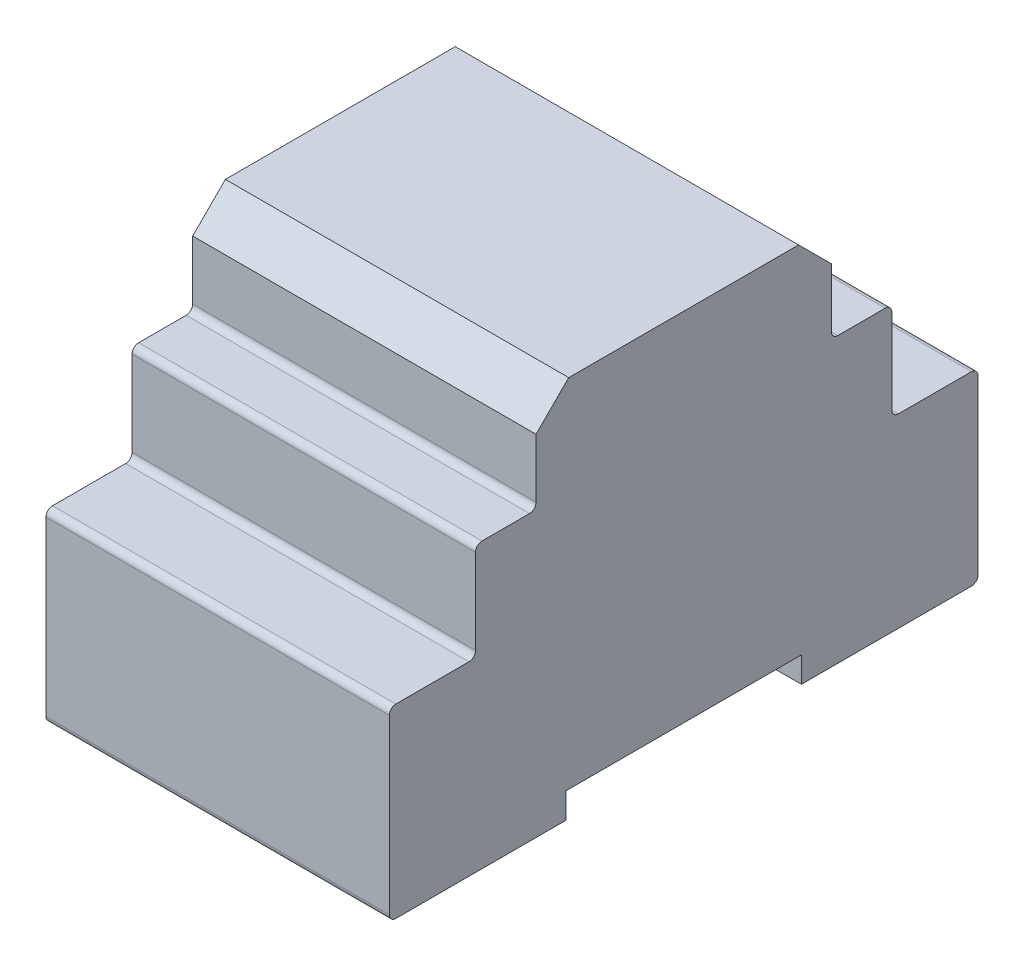
ISO-10303-21;
HEADER;
FILE_DESCRIPTION(('STEP AP214'),'2;1');
FILE_NAME('part.step','',(''),(''),'','','');
FILE_SCHEMA(('AUTOMOTIVE_DESIGN { 1 0 10303 214 1 1 1 1 }'));
ENDSEC;
DATA;
#1=APPLICATION_CONTEXT('core data for automotive mechanical design processes');
#2=APPLICATION_PROTOCOL_DEFINITION('international standard','automotive_design',2000,#1);
#3=PRODUCT_CONTEXT('',#1,'mechanical');
#4=PRODUCT('Part','Part','',(#3));
#5=PRODUCT_RELATED_PRODUCT_CATEGORY('part','',(#4));
#6=PRODUCT_DEFINITION_FORMATION('','',#4);
#7=PRODUCT_DEFINITION_CONTEXT('part definition',#1,'design');
#8=PRODUCT_DEFINITION('design','',#6,#7);
#9=PRODUCT_DEFINITION_SHAPE('','',#8);
#10=(LENGTH_UNIT() NAMED_UNIT(*) SI_UNIT(.MILLI.,.METRE.));
#11=(NAMED_UNIT(*) PLANE_ANGLE_UNIT() SI_UNIT($,.RADIAN.));
#12=(NAMED_UNIT(*) SI_UNIT($,.STERADIAN.) SOLID_ANGLE_UNIT());
#13=UNCERTAINTY_MEASURE_WITH_UNIT(LENGTH_MEASURE(1.E-05),#10,'distance_accuracy_value','');
#14=(GEOMETRIC_REPRESENTATION_CONTEXT(3) GLOBAL_UNCERTAINTY_ASSIGNED_CONTEXT((#13)) GLOBAL_UNIT_ASSIGNED_CONTEXT((#10,
#11,#12)) REPRESENTATION_CONTEXT('',''));
#15=CARTESIAN_POINT('',(0.,0.,0.));
#16=DIRECTION('',(0.,0.,1.));
#17=DIRECTION('',(1.,0.,0.));
#18=AXIS2_PLACEMENT_3D('',#15,#16,#17);
#19=CARTESIAN_POINT('',(0.,0.,0.));
#20=DIRECTION('',(0.,-1.,0.));
#21=DIRECTION('',(0.,0.,-1.));
#22=AXIS2_PLACEMENT_3D('',#19,#20,#21);
#23=PLANE('',#22);
#24=DIRECTION('',(0.,0.,1.));
#25=VECTOR('',#24,1.);
#26=CARTESIAN_POINT('',(0.,0.,0.));
#27=LINE('',#26,#25);
#28=CARTESIAN_POINT('',(0.,0.,-89.));
#29=VERTEX_POINT('',#28);
#30=CARTESIAN_POINT('',(0.,0.,-63.));
#31=VERTEX_POINT('',#30);
#32=EDGE_CURVE('E300',#29,#31,#27,.T.);
#33=ORIENTED_EDGE('',*,*,#32,.F.);
#34=DIRECTION('',(-1.,0.,0.));
#35=VECTOR('',#34,1.);
#36=CARTESIAN_POINT('',(52.5,0.,-89.));
#37=LINE('',#36,#35);
#38=CARTESIAN_POINT('',(52.5,0.,-89.));
#39=VERTEX_POINT('',#38);
#40=EDGE_CURVE('E351',#29,#39,#37,.F.);
#41=ORIENTED_EDGE('',*,*,#40,.T.);
#42=DIRECTION('',(0.,0.,-1.));
#43=VECTOR('',#42,1.);
#44=CARTESIAN_POINT('',(52.5,0.,0.));
#45=LINE('',#44,#43);
#46=CARTESIAN_POINT('',(52.5,0.,-63.));
#47=VERTEX_POINT('',#46);
#48=EDGE_CURVE('E302',#47,#39,#45,.T.);
#49=ORIENTED_EDGE('',*,*,#48,.F.);
#50=DIRECTION('',(1.,0.,0.));
#51=VECTOR('',#50,1.);
#52=CARTESIAN_POINT('',(52.5,0.,-63.));
#53=LINE('',#52,#51);
#54=EDGE_CURVE('E236',#31,#47,#53,.T.);
#55=ORIENTED_EDGE('',*,*,#54,.F.);
#56=EDGE_LOOP('',(#33,#41,#49,#55));
#57=FACE_BOUND('',#56,.T.);
#58=ADVANCED_FACE('F33',(#57),#23,.T.);
#59=CARTESIAN_POINT('',(0.,58.4,-90.));
#60=DIRECTION('',(0.,0.,1.));
#61=DIRECTION('',(1.,0.,0.));
#62=AXIS2_PLACEMENT_3D('',#59,#60,#61);
#63=PLANE('',#62);
#64=DIRECTION('',(0.,-1.,0.));
#65=VECTOR('',#64,1.);
#66=CARTESIAN_POINT('',(52.5,58.4,-90.));
#67=LINE('',#66,#65);
#68=CARTESIAN_POINT('',(52.5,27.4,-90.));
#69=VERTEX_POINT('',#68);
#70=CARTESIAN_POINT('',(52.5,1.,-90.));
#71=VERTEX_POINT('',#70);
#72=EDGE_CURVE('E306',#69,#71,#67,.T.);
#73=ORIENTED_EDGE('',*,*,#72,.T.);
#74=DIRECTION('',(-1.,0.,0.));
#75=VECTOR('',#74,1.);
#76=CARTESIAN_POINT('',(0.,1.,-90.));
#77=LINE('',#76,#75);
#78=CARTESIAN_POINT('',(0.,1.,-90.));
#79=VERTEX_POINT('',#78);
#80=EDGE_CURVE('E336',#71,#79,#77,.T.);
#81=ORIENTED_EDGE('',*,*,#80,.T.);
#82=DIRECTION('',(0.,-1.,0.));
#83=VECTOR('',#82,1.);
#84=CARTESIAN_POINT('',(0.,58.4,-90.));
#85=LINE('',#84,#83);
#86=CARTESIAN_POINT('',(0.,27.4,-90.));
#87=VERTEX_POINT('',#86);
#88=EDGE_CURVE('E299',#87,#79,#85,.T.);
#89=ORIENTED_EDGE('',*,*,#88,.F.);
#90=DIRECTION('',(-1.,0.,0.));
#91=VECTOR('',#90,1.);
#92=CARTESIAN_POINT('',(52.5,27.4,-90.));
#93=LINE('',#92,#91);
#94=EDGE_CURVE('E334',#87,#69,#93,.F.);
#95=ORIENTED_EDGE('',*,*,#94,.T.);
#96=EDGE_LOOP('',(#73,#81,#89,#95));
#97=FACE_BOUND('',#96,.T.);
#98=ADVANCED_FACE('F458',(#97),#63,.F.);
#99=CARTESIAN_POINT('',(0.,58.4,0.));
#100=DIRECTION('',(1.,0.,0.));
#101=DIRECTION('',(0.,0.,-1.));
#102=AXIS2_PLACEMENT_3D('',#99,#100,#101);
#103=PLANE('',#102);
#104=ORIENTED_EDGE('',*,*,#88,.T.);
#105=CARTESIAN_POINT('',(0.,1.,-89.));
#106=DIRECTION('',(1.,0.,0.));
#107=DIRECTION('',(0.,0.,-1.));
#108=AXIS2_PLACEMENT_3D('',#105,#106,#107);
#109=CIRCLE('',#108,1.);
#110=EDGE_CURVE('E349',#79,#29,#109,.F.);
#111=ORIENTED_EDGE('',*,*,#110,.T.);
#112=ORIENTED_EDGE('',*,*,#32,.T.);
#113=DIRECTION('',(0.,-1.,0.));
#114=VECTOR('',#113,1.);
#115=CARTESIAN_POINT('',(0.,3.9,-63.));
#116=LINE('',#115,#114);
#117=CARTESIAN_POINT('',(0.,3.9,-63.));
#118=VERTEX_POINT('',#117);
#119=EDGE_CURVE('E242',#118,#31,#116,.T.);
#120=ORIENTED_EDGE('',*,*,#119,.F.);
#121=DIRECTION('',(0.,0.,-1.));
#122=VECTOR('',#121,1.);
#123=CARTESIAN_POINT('',(0.,3.9,-63.));
#124=LINE('',#123,#122);
#125=CARTESIAN_POINT('',(0.,3.9,-27.));
#126=VERTEX_POINT('',#125);
#127=EDGE_CURVE('E227',#126,#118,#124,.T.);
#128=ORIENTED_EDGE('',*,*,#127,.F.);
#129=DIRECTION('',(0.,-1.,0.));
#130=VECTOR('',#129,1.);
#131=CARTESIAN_POINT('',(0.,3.9,-27.));
#132=LINE('',#131,#130);
#133=CARTESIAN_POINT('',(0.,0.,-27.));
#134=VERTEX_POINT('',#133);
#135=EDGE_CURVE('E224',#126,#134,#132,.T.);
#136=ORIENTED_EDGE('',*,*,#135,.T.);
#137=CARTESIAN_POINT('',(0.,0.,-1.));
#138=VERTEX_POINT('',#137);
#139=EDGE_CURVE('E291',#134,#138,#27,.T.);
#140=ORIENTED_EDGE('',*,*,#139,.T.);
#141=CARTESIAN_POINT('',(0.,1.,-1.));
#142=DIRECTION('',(1.,0.,0.));
#143=DIRECTION('',(0.,0.,-1.));
#144=AXIS2_PLACEMENT_3D('',#141,#142,#143);
#145=CIRCLE('',#144,1.);
#146=CARTESIAN_POINT('',(0.,1.,0.));
#147=VERTEX_POINT('',#146);
#148=EDGE_CURVE('E347',#138,#147,#145,.F.);
#149=ORIENTED_EDGE('',*,*,#148,.T.);
#150=DIRECTION('',(0.,-1.,0.));
#151=VECTOR('',#150,1.);
#152=CARTESIAN_POINT('',(0.,58.4,0.));
#153=LINE('',#152,#151);
#154=CARTESIAN_POINT('',(0.,27.4,0.));
#155=VERTEX_POINT('',#154);
#156=EDGE_CURVE('E311',#155,#147,#153,.T.);
#157=ORIENTED_EDGE('',*,*,#156,.F.);
#158=CARTESIAN_POINT('',(0.,27.4,-1.));
#159=DIRECTION('',(1.,0.,0.));
#160=DIRECTION('',(0.,0.,-1.));
#161=AXIS2_PLACEMENT_3D('',#158,#159,#160);
#162=CIRCLE('',#161,1.);
#163=CARTESIAN_POINT('',(0.,28.4,-1.));
#164=VERTEX_POINT('',#163);
#165=EDGE_CURVE('E345',#155,#164,#162,.F.);
#166=ORIENTED_EDGE('',*,*,#165,.T.);
#167=DIRECTION('',(0.,0.,1.));
#168=VECTOR('',#167,1.);
#169=CARTESIAN_POINT('',(0.,28.4,0.));
#170=LINE('',#169,#168);
#171=CARTESIAN_POINT('',(0.,28.4,-12.17));
#172=VERTEX_POINT('',#171);
#173=EDGE_CURVE('E247',#172,#164,#170,.T.);
#174=ORIENTED_EDGE('',*,*,#173,.F.);
#175=CARTESIAN_POINT('',(0.,29.4,-12.17));
#176=DIRECTION('',(1.,0.,0.));
#177=DIRECTION('',(0.,0.,-1.));
#178=AXIS2_PLACEMENT_3D('',#175,#176,#177);
#179=CIRCLE('',#178,1.);
#180=CARTESIAN_POINT('',(0.,29.4,-13.17));
#181=VERTEX_POINT('',#180);
#182=EDGE_CURVE('E406',#172,#181,#179,.T.);
#183=ORIENTED_EDGE('',*,*,#182,.T.);
#184=DIRECTION('',(0.,1.,0.));
#185=VECTOR('',#184,1.);
#186=CARTESIAN_POINT('',(0.,28.4,-13.17));
#187=LINE('',#186,#185);
#188=CARTESIAN_POINT('',(0.,42.4,-13.17));
#189=VERTEX_POINT('',#188);
#190=EDGE_CURVE('E255',#181,#189,#187,.T.);
#191=ORIENTED_EDGE('',*,*,#190,.T.);
#192=CARTESIAN_POINT('',(0.,42.4,-14.17));
#193=DIRECTION('',(1.,0.,0.));
#194=DIRECTION('',(0.,0.,-1.));
#195=AXIS2_PLACEMENT_3D('',#192,#193,#194);
#196=CIRCLE('',#195,1.);
#197=CARTESIAN_POINT('',(0.,43.4,-14.17));
#198=VERTEX_POINT('',#197);
#199=EDGE_CURVE('E343',#189,#198,#196,.F.);
#200=ORIENTED_EDGE('',*,*,#199,.T.);
#201=DIRECTION('',(0.,0.,1.));
#202=VECTOR('',#201,1.);
#203=CARTESIAN_POINT('',(0.,43.4,0.));
#204=LINE('',#203,#202);
#205=CARTESIAN_POINT('',(0.,43.4,-21.425));
#206=VERTEX_POINT('',#205);
#207=EDGE_CURVE('E270',#206,#198,#204,.T.);
#208=ORIENTED_EDGE('',*,*,#207,.F.);
#209=CARTESIAN_POINT('',(0.,44.4,-21.425));
#210=DIRECTION('',(1.,0.,0.));
#211=DIRECTION('',(0.,0.,-1.));
#212=AXIS2_PLACEMENT_3D('',#209,#210,#211);
#213=CIRCLE('',#212,1.);
#214=CARTESIAN_POINT('',(0.,44.4,-22.425));
#215=VERTEX_POINT('',#214);
#216=EDGE_CURVE('E410',#206,#215,#213,.T.);
#217=ORIENTED_EDGE('',*,*,#216,.T.);
#218=DIRECTION('',(0.,1.,0.));
#219=VECTOR('',#218,1.);
#220=CARTESIAN_POINT('',(0.,43.4,-22.425));
#221=LINE('',#220,#219);
#222=CARTESIAN_POINT('',(0.,53.4,-22.425));
#223=VERTEX_POINT('',#222);
#224=EDGE_CURVE('E279',#215,#223,#221,.T.);
#225=ORIENTED_EDGE('',*,*,#224,.T.);
#226=DIRECTION('',(0.,-0.707106781186546,0.707106781186549));
#227=VECTOR('',#226,1.);
#228=CARTESIAN_POINT('',(0.,53.4,-22.425));
#229=LINE('',#228,#227);
#230=CARTESIAN_POINT('',(0.,58.4,-27.425));
#231=VERTEX_POINT('',#230);
#232=EDGE_CURVE('E326',#223,#231,#229,.F.);
#233=ORIENTED_EDGE('',*,*,#232,.T.);
#234=DIRECTION('',(0.,0.,1.));
#235=VECTOR('',#234,1.);
#236=CARTESIAN_POINT('',(0.,58.4,0.));
#237=LINE('',#236,#235);
#238=CARTESIAN_POINT('',(0.,58.4,-62.575));
#239=VERTEX_POINT('',#238);
#240=EDGE_CURVE('E293',#239,#231,#237,.T.);
#241=ORIENTED_EDGE('',*,*,#240,.F.);
#242=DIRECTION('',(0.,0.707106781186546,0.707106781186549));
#243=VECTOR('',#242,1.);
#244=CARTESIAN_POINT('',(0.,53.4,-67.575));
#245=LINE('',#244,#243);
#246=CARTESIAN_POINT('',(0.,53.4,-67.575));
#247=VERTEX_POINT('',#246);
#248=EDGE_CURVE('E328',#239,#247,#245,.F.);
#249=ORIENTED_EDGE('',*,*,#248,.T.);
#250=DIRECTION('',(0.,1.,0.));
#251=VECTOR('',#250,1.);
#252=CARTESIAN_POINT('',(0.,43.4,-67.575));
#253=LINE('',#252,#251);
#254=CARTESIAN_POINT('',(0.,44.4,-67.575));
#255=VERTEX_POINT('',#254);
#256=EDGE_CURVE('E288',#255,#247,#253,.T.);
#257=ORIENTED_EDGE('',*,*,#256,.F.);
#258=CARTESIAN_POINT('',(0.,44.4,-68.575));
#259=DIRECTION('',(1.,0.,0.));
#260=DIRECTION('',(0.,0.,-1.));
#261=AXIS2_PLACEMENT_3D('',#258,#259,#260);
#262=CIRCLE('',#261,1.);
#263=CARTESIAN_POINT('',(0.,43.4,-68.575));
#264=VERTEX_POINT('',#263);
#265=EDGE_CURVE('E11',#255,#264,#262,.T.);
#266=ORIENTED_EDGE('',*,*,#265,.T.);
#267=DIRECTION('',(0.,0.,1.));
#268=VECTOR('',#267,1.);
#269=CARTESIAN_POINT('',(0.,43.4,-90.));
#270=LINE('',#269,#268);
#271=CARTESIAN_POINT('',(0.,43.4,-75.82));
#272=VERTEX_POINT('',#271);
#273=EDGE_CURVE('E281',#272,#264,#270,.T.);
#274=ORIENTED_EDGE('',*,*,#273,.F.);
#275=CARTESIAN_POINT('',(0.,42.4,-75.82));
#276=DIRECTION('',(1.,0.,0.));
#277=DIRECTION('',(0.,0.,-1.));
#278=AXIS2_PLACEMENT_3D('',#275,#276,#277);
#279=CIRCLE('',#278,1.);
#280=CARTESIAN_POINT('',(0.,42.4,-76.82));
#281=VERTEX_POINT('',#280);
#282=EDGE_CURVE('E339',#272,#281,#279,.F.);
#283=ORIENTED_EDGE('',*,*,#282,.T.);
#284=DIRECTION('',(0.,1.,0.));
#285=VECTOR('',#284,1.);
#286=CARTESIAN_POINT('',(0.,28.4,-76.82));
#287=LINE('',#286,#285);
#288=CARTESIAN_POINT('',(0.,29.4,-76.82));
#289=VERTEX_POINT('',#288);
#290=EDGE_CURVE('E266',#289,#281,#287,.T.);
#291=ORIENTED_EDGE('',*,*,#290,.F.);
#292=CARTESIAN_POINT('',(0.,29.4,-77.82));
#293=DIRECTION('',(1.,0.,0.));
#294=DIRECTION('',(0.,0.,-1.));
#295=AXIS2_PLACEMENT_3D('',#292,#293,#294);
#296=CIRCLE('',#295,1.);
#297=CARTESIAN_POINT('',(0.,28.4,-77.82));
#298=VERTEX_POINT('',#297);
#299=EDGE_CURVE('E416',#289,#298,#296,.T.);
#300=ORIENTED_EDGE('',*,*,#299,.T.);
#301=DIRECTION('',(0.,0.,1.));
#302=VECTOR('',#301,1.);
#303=CARTESIAN_POINT('',(0.,28.4,-90.));
#304=LINE('',#303,#302);
#305=CARTESIAN_POINT('',(0.,28.4,-89.));
#306=VERTEX_POINT('',#305);
#307=EDGE_CURVE('E258',#306,#298,#304,.T.);
#308=ORIENTED_EDGE('',*,*,#307,.F.);
#309=CARTESIAN_POINT('',(0.,27.4,-89.));
#310=DIRECTION('',(1.,0.,0.));
#311=DIRECTION('',(0.,0.,-1.));
#312=AXIS2_PLACEMENT_3D('',#309,#310,#311);
#313=CIRCLE('',#312,1.);
#314=EDGE_CURVE('E341',#306,#87,#313,.F.);
#315=ORIENTED_EDGE('',*,*,#314,.T.);
#316=EDGE_LOOP('',(#104,#111,#112,#120,#128,#136,#140,#149,#157,#166,#174,#183,#191,#200,#208,
#217,#225,#233,#241,#249,#257,#266,#274,#283,#291,#300,#308,#315));
#317=FACE_BOUND('',#316,.T.);
#318=ADVANCED_FACE('F430',(#317),#103,.F.);
#319=CARTESIAN_POINT('',(0.,58.4,0.));
#320=DIRECTION('',(0.,0.,-1.));
#321=DIRECTION('',(-1.,0.,0.));
#322=AXIS2_PLACEMENT_3D('',#319,#320,#321);
#323=PLANE('',#322);
#324=ORIENTED_EDGE('',*,*,#156,.T.);
#325=DIRECTION('',(1.,0.,0.));
#326=VECTOR('',#325,1.);
#327=CARTESIAN_POINT('',(52.5,1.,0.));
#328=LINE('',#327,#326);
#329=CARTESIAN_POINT('',(52.5,1.,0.));
#330=VERTEX_POINT('',#329);
#331=EDGE_CURVE('E366',#147,#330,#328,.T.);
#332=ORIENTED_EDGE('',*,*,#331,.T.);
#333=DIRECTION('',(0.,-1.,0.));
#334=VECTOR('',#333,1.);
#335=CARTESIAN_POINT('',(52.5,58.4,0.));
#336=LINE('',#335,#334);
#337=CARTESIAN_POINT('',(52.5,27.4,0.));
#338=VERTEX_POINT('',#337);
#339=EDGE_CURVE('E309',#338,#330,#336,.T.);
#340=ORIENTED_EDGE('',*,*,#339,.F.);
#341=DIRECTION('',(1.,0.,0.));
#342=VECTOR('',#341,1.);
#343=CARTESIAN_POINT('',(0.,27.4,0.));
#344=LINE('',#343,#342);
#345=EDGE_CURVE('E364',#338,#155,#344,.F.);
#346=ORIENTED_EDGE('',*,*,#345,.T.);
#347=EDGE_LOOP('',(#324,#332,#340,#346));
#348=FACE_BOUND('',#347,.T.);
#349=ADVANCED_FACE('F487',(#348),#323,.F.);
#350=CARTESIAN_POINT('',(52.5,58.4,0.));
#351=DIRECTION('',(-1.,0.,0.));
#352=DIRECTION('',(0.,0.,1.));
#353=AXIS2_PLACEMENT_3D('',#350,#351,#352);
#354=PLANE('',#353);
#355=ORIENTED_EDGE('',*,*,#48,.T.);
#356=CARTESIAN_POINT('',(52.5,1.,-89.));
#357=DIRECTION('',(-1.,0.,0.));
#358=DIRECTION('',(0.,0.,1.));
#359=AXIS2_PLACEMENT_3D('',#356,#357,#358);
#360=CIRCLE('',#359,1.);
#361=EDGE_CURVE('E362',#39,#71,#360,.F.);
#362=ORIENTED_EDGE('',*,*,#361,.T.);
#363=ORIENTED_EDGE('',*,*,#72,.F.);
#364=CARTESIAN_POINT('',(52.5,27.4,-89.));
#365=DIRECTION('',(-1.,0.,0.));
#366=DIRECTION('',(0.,0.,1.));
#367=AXIS2_PLACEMENT_3D('',#364,#365,#366);
#368=CIRCLE('',#367,1.);
#369=CARTESIAN_POINT('',(52.5,28.4,-89.));
#370=VERTEX_POINT('',#369);
#371=EDGE_CURVE('E355',#69,#370,#368,.F.);
#372=ORIENTED_EDGE('',*,*,#371,.T.);
#373=DIRECTION('',(0.,0.,-1.));
#374=VECTOR('',#373,1.);
#375=CARTESIAN_POINT('',(52.5,28.4,-90.));
#376=LINE('',#375,#374);
#377=CARTESIAN_POINT('',(52.5,28.4,-77.82));
#378=VERTEX_POINT('',#377);
#379=EDGE_CURVE('E263',#378,#370,#376,.T.);
#380=ORIENTED_EDGE('',*,*,#379,.F.);
#381=CARTESIAN_POINT('',(52.5,29.4,-77.82));
#382=DIRECTION('',(-1.,0.,0.));
#383=DIRECTION('',(0.,0.,1.));
#384=AXIS2_PLACEMENT_3D('',#381,#382,#383);
#385=CIRCLE('',#384,1.);
#386=CARTESIAN_POINT('',(52.5,29.4,-76.82));
#387=VERTEX_POINT('',#386);
#388=EDGE_CURVE('E414',#378,#387,#385,.T.);
#389=ORIENTED_EDGE('',*,*,#388,.T.);
#390=DIRECTION('',(0.,1.,0.));
#391=VECTOR('',#390,1.);
#392=CARTESIAN_POINT('',(52.5,28.4,-76.82));
#393=LINE('',#392,#391);
#394=CARTESIAN_POINT('',(52.5,42.4,-76.82));
#395=VERTEX_POINT('',#394);
#396=EDGE_CURVE('E267',#387,#395,#393,.T.);
#397=ORIENTED_EDGE('',*,*,#396,.T.);
#398=CARTESIAN_POINT('',(52.5,42.4,-75.82));
#399=DIRECTION('',(-1.,0.,0.));
#400=DIRECTION('',(0.,0.,1.));
#401=AXIS2_PLACEMENT_3D('',#398,#399,#400);
#402=CIRCLE('',#401,1.);
#403=CARTESIAN_POINT('',(52.5,43.4,-75.82));
#404=VERTEX_POINT('',#403);
#405=EDGE_CURVE('E353',#395,#404,#402,.F.);
#406=ORIENTED_EDGE('',*,*,#405,.T.);
#407=DIRECTION('',(0.,0.,-1.));
#408=VECTOR('',#407,1.);
#409=CARTESIAN_POINT('',(52.5,43.4,-90.));
#410=LINE('',#409,#408);
#411=CARTESIAN_POINT('',(52.5,43.4,-68.575));
#412=VERTEX_POINT('',#411);
#413=EDGE_CURVE('E285',#412,#404,#410,.T.);
#414=ORIENTED_EDGE('',*,*,#413,.F.);
#415=CARTESIAN_POINT('',(52.5,44.4,-68.575));
#416=DIRECTION('',(-1.,0.,0.));
#417=DIRECTION('',(0.,0.,1.));
#418=AXIS2_PLACEMENT_3D('',#415,#416,#417);
#419=CIRCLE('',#418,1.);
#420=CARTESIAN_POINT('',(52.5,44.4,-67.575));
#421=VERTEX_POINT('',#420);
#422=EDGE_CURVE('E41',#412,#421,#419,.T.);
#423=ORIENTED_EDGE('',*,*,#422,.T.);
#424=DIRECTION('',(0.,1.,0.));
#425=VECTOR('',#424,1.);
#426=CARTESIAN_POINT('',(52.5,43.4,-67.575));
#427=LINE('',#426,#425);
#428=CARTESIAN_POINT('',(52.5,53.4,-67.575));
#429=VERTEX_POINT('',#428);
#430=EDGE_CURVE('E289',#421,#429,#427,.T.);
#431=ORIENTED_EDGE('',*,*,#430,.T.);
#432=DIRECTION('',(0.,-0.707106781186546,-0.707106781186549));
#433=VECTOR('',#432,1.);
#434=CARTESIAN_POINT('',(52.5,53.4,-67.575));
#435=LINE('',#434,#433);
#436=CARTESIAN_POINT('',(52.5,58.4,-62.575));
#437=VERTEX_POINT('',#436);
#438=EDGE_CURVE('E320',#429,#437,#435,.F.);
#439=ORIENTED_EDGE('',*,*,#438,.T.);
#440=DIRECTION('',(0.,0.,-1.));
#441=VECTOR('',#440,1.);
#442=CARTESIAN_POINT('',(52.5,58.4,0.));
#443=LINE('',#442,#441);
#444=CARTESIAN_POINT('',(52.5,58.4,-27.425));
#445=VERTEX_POINT('',#444);
#446=EDGE_CURVE('E296',#445,#437,#443,.T.);
#447=ORIENTED_EDGE('',*,*,#446,.F.);
#448=DIRECTION('',(0.,0.707106781186546,-0.707106781186549));
#449=VECTOR('',#448,1.);
#450=CARTESIAN_POINT('',(52.5,53.4,-22.425));
#451=LINE('',#450,#449);
#452=CARTESIAN_POINT('',(52.5,53.4,-22.425));
#453=VERTEX_POINT('',#452);
#454=EDGE_CURVE('E317',#445,#453,#451,.F.);
#455=ORIENTED_EDGE('',*,*,#454,.T.);
#456=DIRECTION('',(0.,1.,0.));
#457=VECTOR('',#456,1.);
#458=CARTESIAN_POINT('',(52.5,43.4,-22.425));
#459=LINE('',#458,#457);
#460=CARTESIAN_POINT('',(52.5,44.4,-22.425));
#461=VERTEX_POINT('',#460);
#462=EDGE_CURVE('E278',#461,#453,#459,.T.);
#463=ORIENTED_EDGE('',*,*,#462,.F.);
#464=CARTESIAN_POINT('',(52.5,44.4,-21.425));
#465=DIRECTION('',(-1.,0.,0.));
#466=DIRECTION('',(0.,0.,1.));
#467=AXIS2_PLACEMENT_3D('',#464,#465,#466);
#468=CIRCLE('',#467,1.);
#469=CARTESIAN_POINT('',(52.5,43.4,-21.425));
#470=VERTEX_POINT('',#469);
#471=EDGE_CURVE('E412',#461,#470,#468,.T.);
#472=ORIENTED_EDGE('',*,*,#471,.T.);
#473=DIRECTION('',(0.,0.,-1.));
#474=VECTOR('',#473,1.);
#475=CARTESIAN_POINT('',(52.5,43.4,0.));
#476=LINE('',#475,#474);
#477=CARTESIAN_POINT('',(52.5,43.4,-14.17));
#478=VERTEX_POINT('',#477);
#479=EDGE_CURVE('E275',#478,#470,#476,.T.);
#480=ORIENTED_EDGE('',*,*,#479,.F.);
#481=CARTESIAN_POINT('',(52.5,42.4,-14.17));
#482=DIRECTION('',(-1.,0.,0.));
#483=DIRECTION('',(0.,0.,1.));
#484=AXIS2_PLACEMENT_3D('',#481,#482,#483);
#485=CIRCLE('',#484,1.);
#486=CARTESIAN_POINT('',(52.5,42.4,-13.17));
#487=VERTEX_POINT('',#486);
#488=EDGE_CURVE('E357',#478,#487,#485,.F.);
#489=ORIENTED_EDGE('',*,*,#488,.T.);
#490=DIRECTION('',(0.,1.,0.));
#491=VECTOR('',#490,1.);
#492=CARTESIAN_POINT('',(52.5,28.4,-13.17));
#493=LINE('',#492,#491);
#494=CARTESIAN_POINT('',(52.5,29.4,-13.17));
#495=VERTEX_POINT('',#494);
#496=EDGE_CURVE('E254',#495,#487,#493,.T.);
#497=ORIENTED_EDGE('',*,*,#496,.F.);
#498=CARTESIAN_POINT('',(52.5,29.4,-12.17));
#499=DIRECTION('',(-1.,0.,0.));
#500=DIRECTION('',(0.,0.,1.));
#501=AXIS2_PLACEMENT_3D('',#498,#499,#500);
#502=CIRCLE('',#501,1.);
#503=CARTESIAN_POINT('',(52.5,28.4,-12.17));
#504=VERTEX_POINT('',#503);
#505=EDGE_CURVE('E408',#495,#504,#502,.T.);
#506=ORIENTED_EDGE('',*,*,#505,.T.);
#507=DIRECTION('',(0.,0.,-1.));
#508=VECTOR('',#507,1.);
#509=CARTESIAN_POINT('',(52.5,28.4,0.));
#510=LINE('',#509,#508);
#511=CARTESIAN_POINT('',(52.5,28.4,-1.));
#512=VERTEX_POINT('',#511);
#513=EDGE_CURVE('E250',#512,#504,#510,.T.);
#514=ORIENTED_EDGE('',*,*,#513,.F.);
#515=CARTESIAN_POINT('',(52.5,27.4,-1.));
#516=DIRECTION('',(-1.,0.,0.));
#517=DIRECTION('',(0.,0.,1.));
#518=AXIS2_PLACEMENT_3D('',#515,#516,#517);
#519=CIRCLE('',#518,1.);
#520=EDGE_CURVE('E359',#512,#338,#519,.F.);
#521=ORIENTED_EDGE('',*,*,#520,.T.);
#522=ORIENTED_EDGE('',*,*,#339,.T.);
#523=CARTESIAN_POINT('',(52.5,1.,-1.));
#524=DIRECTION('',(-1.,0.,0.));
#525=DIRECTION('',(0.,0.,1.));
#526=AXIS2_PLACEMENT_3D('',#523,#524,#525);
#527=CIRCLE('',#526,1.);
#528=CARTESIAN_POINT('',(52.5,0.,-1.));
#529=VERTEX_POINT('',#528);
#530=EDGE_CURVE('E48',#330,#529,#527,.F.);
#531=ORIENTED_EDGE('',*,*,#530,.T.);
#532=CARTESIAN_POINT('',(52.5,0.,-27.));
#533=VERTEX_POINT('',#532);
#534=EDGE_CURVE('E240',#529,#533,#45,.T.);
#535=ORIENTED_EDGE('',*,*,#534,.T.);
#536=DIRECTION('',(0.,-1.,0.));
#537=VECTOR('',#536,1.);
#538=CARTESIAN_POINT('',(52.5,3.9,-27.));
#539=LINE('',#538,#537);
#540=CARTESIAN_POINT('',(52.5,3.9,-27.));
#541=VERTEX_POINT('',#540);
#542=EDGE_CURVE('E221',#541,#533,#539,.T.);
#543=ORIENTED_EDGE('',*,*,#542,.F.);
#544=DIRECTION('',(0.,0.,1.));
#545=VECTOR('',#544,1.);
#546=CARTESIAN_POINT('',(52.5,3.9,-63.));
#547=LINE('',#546,#545);
#548=CARTESIAN_POINT('',(52.5,3.9,-63.));
#549=VERTEX_POINT('',#548);
#550=EDGE_CURVE('E228',#549,#541,#547,.T.);
#551=ORIENTED_EDGE('',*,*,#550,.F.);
#552=DIRECTION('',(0.,-1.,0.));
#553=VECTOR('',#552,1.);
#554=CARTESIAN_POINT('',(52.5,3.9,-63.));
#555=LINE('',#554,#553);
#556=EDGE_CURVE('E251',#549,#47,#555,.T.);
#557=ORIENTED_EDGE('',*,*,#556,.T.);
#558=EDGE_LOOP('',(#355,#362,#363,#372,#380,#389,#397,#406,#414,#423,#431,#439,#447,#455,#463,
#472,#480,#489,#497,#506,#514,#521,#522,#531,#535,#543,#551,#557));
#559=FACE_BOUND('',#558,.T.);
#560=ADVANCED_FACE('F239',(#559),#354,.F.);
#561=CARTESIAN_POINT('',(0.,58.4,0.));
#562=DIRECTION('',(0.,-1.,0.));
#563=DIRECTION('',(0.,0.,-1.));
#564=AXIS2_PLACEMENT_3D('',#561,#562,#563);
#565=PLANE('',#564);
#566=ORIENTED_EDGE('',*,*,#446,.T.);
#567=DIRECTION('',(-1.,0.,0.));
#568=VECTOR('',#567,1.);
#569=CARTESIAN_POINT('',(0.,58.4,-62.575));
#570=LINE('',#569,#568);
#571=EDGE_CURVE('E324',#437,#239,#570,.T.);
#572=ORIENTED_EDGE('',*,*,#571,.T.);
#573=ORIENTED_EDGE('',*,*,#240,.T.);
#574=DIRECTION('',(1.,0.,0.));
#575=VECTOR('',#574,1.);
#576=CARTESIAN_POINT('',(0.,58.4,-27.425));
#577=LINE('',#576,#575);
#578=EDGE_CURVE('E322',#231,#445,#577,.T.);
#579=ORIENTED_EDGE('',*,*,#578,.T.);
#580=EDGE_LOOP('',(#566,#572,#573,#579));
#581=FACE_BOUND('',#580,.T.);
#582=ADVANCED_FACE('F533',(#581),#565,.F.);
#583=ORIENTED_EDGE('',*,*,#534,.F.);
#584=DIRECTION('',(1.,0.,0.));
#585=VECTOR('',#584,1.);
#586=CARTESIAN_POINT('',(0.,0.,-1.));
#587=LINE('',#586,#585);
#588=EDGE_CURVE('E368',#529,#138,#587,.F.);
#589=ORIENTED_EDGE('',*,*,#588,.T.);
#590=ORIENTED_EDGE('',*,*,#139,.F.);
#591=DIRECTION('',(-1.,0.,0.));
#592=VECTOR('',#591,1.);
#593=CARTESIAN_POINT('',(52.5,0.,-27.));
#594=LINE('',#593,#592);
#595=EDGE_CURVE('E472',#533,#134,#594,.T.);
#596=ORIENTED_EDGE('',*,*,#595,.F.);
#597=EDGE_LOOP('',(#583,#589,#590,#596));
#598=FACE_BOUND('',#597,.T.);
#599=ADVANCED_FACE('F482',(#598),#23,.T.);
#600=CARTESIAN_POINT('',(0.,43.4,-67.575));
#601=DIRECTION('',(0.,0.,1.));
#602=DIRECTION('',(1.,0.,0.));
#603=AXIS2_PLACEMENT_3D('',#600,#601,#602);
#604=PLANE('',#603);
#605=ORIENTED_EDGE('',*,*,#430,.F.);
#606=DIRECTION('',(1.,0.,0.));
#607=VECTOR('',#606,1.);
#608=CARTESIAN_POINT('',(0.,44.4,-67.575));
#609=LINE('',#608,#607);
#610=EDGE_CURVE('E404',#421,#255,#609,.F.);
#611=ORIENTED_EDGE('',*,*,#610,.T.);
#612=ORIENTED_EDGE('',*,*,#256,.T.);
#613=DIRECTION('',(1.,0.,0.));
#614=VECTOR('',#613,1.);
#615=CARTESIAN_POINT('',(0.,53.4,-67.575));
#616=LINE('',#615,#614);
#617=EDGE_CURVE('E314',#247,#429,#616,.T.);
#618=ORIENTED_EDGE('',*,*,#617,.T.);
#619=EDGE_LOOP('',(#605,#611,#612,#618));
#620=FACE_BOUND('',#619,.T.);
#621=ADVANCED_FACE('F424',(#620),#604,.F.);
#622=CARTESIAN_POINT('',(0.,43.4,0.));
#623=DIRECTION('',(0.,1.,0.));
#624=DIRECTION('',(0.,0.,1.));
#625=AXIS2_PLACEMENT_3D('',#622,#623,#624);
#626=PLANE('',#625);
#627=ORIENTED_EDGE('',*,*,#413,.T.);
#628=DIRECTION('',(1.,0.,0.));
#629=VECTOR('',#628,1.);
#630=CARTESIAN_POINT('',(0.,43.4,-75.82));
#631=LINE('',#630,#629);
#632=EDGE_CURVE('E402',#404,#272,#631,.F.);
#633=ORIENTED_EDGE('',*,*,#632,.T.);
#634=ORIENTED_EDGE('',*,*,#273,.T.);
#635=DIRECTION('',(1.,0.,0.));
#636=VECTOR('',#635,1.);
#637=CARTESIAN_POINT('',(0.,43.4,-68.575));
#638=LINE('',#637,#636);
#639=EDGE_CURVE('E399',#264,#412,#638,.T.);
#640=ORIENTED_EDGE('',*,*,#639,.T.);
#641=EDGE_LOOP('',(#627,#633,#634,#640));
#642=FACE_BOUND('',#641,.T.);
#643=ADVANCED_FACE('F433',(#642),#626,.T.);
#644=CARTESIAN_POINT('',(0.,43.4,-22.425));
#645=DIRECTION('',(0.,0.,-1.));
#646=DIRECTION('',(-1.,0.,0.));
#647=AXIS2_PLACEMENT_3D('',#644,#645,#646);
#648=PLANE('',#647);
#649=ORIENTED_EDGE('',*,*,#224,.F.);
#650=DIRECTION('',(-1.,0.,0.));
#651=VECTOR('',#650,1.);
#652=CARTESIAN_POINT('',(52.5,44.4,-22.425));
#653=LINE('',#652,#651);
#654=EDGE_CURVE('E386',#215,#461,#653,.F.);
#655=ORIENTED_EDGE('',*,*,#654,.T.);
#656=ORIENTED_EDGE('',*,*,#462,.T.);
#657=DIRECTION('',(-1.,0.,0.));
#658=VECTOR('',#657,1.);
#659=CARTESIAN_POINT('',(0.,53.4,-22.425));
#660=LINE('',#659,#658);
#661=EDGE_CURVE('E331',#453,#223,#660,.T.);
#662=ORIENTED_EDGE('',*,*,#661,.T.);
#663=EDGE_LOOP('',(#649,#655,#656,#662));
#664=FACE_BOUND('',#663,.T.);
#665=ADVANCED_FACE('F523',(#664),#648,.F.);
#666=CARTESIAN_POINT('',(0.,43.4,0.));
#667=DIRECTION('',(0.,-1.,0.));
#668=DIRECTION('',(0.,0.,-1.));
#669=AXIS2_PLACEMENT_3D('',#666,#667,#668);
#670=PLANE('',#669);
#671=ORIENTED_EDGE('',*,*,#207,.T.);
#672=DIRECTION('',(-1.,0.,0.));
#673=VECTOR('',#672,1.);
#674=CARTESIAN_POINT('',(0.,43.4,-14.17));
#675=LINE('',#674,#673);
#676=EDGE_CURVE('E384',#198,#478,#675,.F.);
#677=ORIENTED_EDGE('',*,*,#676,.T.);
#678=ORIENTED_EDGE('',*,*,#479,.T.);
#679=DIRECTION('',(-1.,0.,0.));
#680=VECTOR('',#679,1.);
#681=CARTESIAN_POINT('',(0.,43.4,-21.425));
#682=LINE('',#681,#680);
#683=EDGE_CURVE('E381',#470,#206,#682,.T.);
#684=ORIENTED_EDGE('',*,*,#683,.T.);
#685=EDGE_LOOP('',(#671,#677,#678,#684));
#686=FACE_BOUND('',#685,.T.);
#687=ADVANCED_FACE('F513',(#686),#670,.F.);
#688=CARTESIAN_POINT('',(0.,28.4,-76.82));
#689=DIRECTION('',(0.,0.,1.));
#690=DIRECTION('',(1.,0.,0.));
#691=AXIS2_PLACEMENT_3D('',#688,#689,#690);
#692=PLANE('',#691);
#693=ORIENTED_EDGE('',*,*,#396,.F.);
#694=DIRECTION('',(1.,0.,0.));
#695=VECTOR('',#694,1.);
#696=CARTESIAN_POINT('',(0.,29.4,-76.82));
#697=LINE('',#696,#695);
#698=EDGE_CURVE('E397',#387,#289,#697,.F.);
#699=ORIENTED_EDGE('',*,*,#698,.T.);
#700=ORIENTED_EDGE('',*,*,#290,.T.);
#701=DIRECTION('',(1.,0.,0.));
#702=VECTOR('',#701,1.);
#703=CARTESIAN_POINT('',(52.5,42.4,-76.82));
#704=LINE('',#703,#702);
#705=EDGE_CURVE('E394',#281,#395,#704,.T.);
#706=ORIENTED_EDGE('',*,*,#705,.T.);
#707=EDGE_LOOP('',(#693,#699,#700,#706));
#708=FACE_BOUND('',#707,.T.);
#709=ADVANCED_FACE('F442',(#708),#692,.F.);
#710=CARTESIAN_POINT('',(0.,28.4,0.));
#711=DIRECTION('',(0.,1.,0.));
#712=DIRECTION('',(0.,0.,1.));
#713=AXIS2_PLACEMENT_3D('',#710,#711,#712);
#714=PLANE('',#713);
#715=ORIENTED_EDGE('',*,*,#379,.T.);
#716=DIRECTION('',(-1.,0.,0.));
#717=VECTOR('',#716,1.);
#718=CARTESIAN_POINT('',(0.,28.4,-89.));
#719=LINE('',#718,#717);
#720=EDGE_CURVE('E391',#370,#306,#719,.T.);
#721=ORIENTED_EDGE('',*,*,#720,.T.);
#722=ORIENTED_EDGE('',*,*,#307,.T.);
#723=DIRECTION('',(1.,0.,0.));
#724=VECTOR('',#723,1.);
#725=CARTESIAN_POINT('',(0.,28.4,-77.82));
#726=LINE('',#725,#724);
#727=EDGE_CURVE('E388',#298,#378,#726,.T.);
#728=ORIENTED_EDGE('',*,*,#727,.T.);
#729=EDGE_LOOP('',(#715,#721,#722,#728));
#730=FACE_BOUND('',#729,.T.);
#731=ADVANCED_FACE('F449',(#730),#714,.T.);
#732=CARTESIAN_POINT('',(0.,28.4,-13.17));
#733=DIRECTION('',(0.,0.,-1.));
#734=DIRECTION('',(-1.,0.,0.));
#735=AXIS2_PLACEMENT_3D('',#732,#733,#734);
#736=PLANE('',#735);
#737=ORIENTED_EDGE('',*,*,#190,.F.);
#738=DIRECTION('',(-1.,0.,0.));
#739=VECTOR('',#738,1.);
#740=CARTESIAN_POINT('',(52.5,29.4,-13.17));
#741=LINE('',#740,#739);
#742=EDGE_CURVE('E379',#181,#495,#741,.F.);
#743=ORIENTED_EDGE('',*,*,#742,.T.);
#744=ORIENTED_EDGE('',*,*,#496,.T.);
#745=DIRECTION('',(-1.,0.,0.));
#746=VECTOR('',#745,1.);
#747=CARTESIAN_POINT('',(0.,42.4,-13.17));
#748=LINE('',#747,#746);
#749=EDGE_CURVE('E376',#487,#189,#748,.T.);
#750=ORIENTED_EDGE('',*,*,#749,.T.);
#751=EDGE_LOOP('',(#737,#743,#744,#750));
#752=FACE_BOUND('',#751,.T.);
#753=ADVANCED_FACE('F504',(#752),#736,.F.);
#754=CARTESIAN_POINT('',(0.,28.4,0.));
#755=DIRECTION('',(0.,-1.,0.));
#756=DIRECTION('',(0.,0.,-1.));
#757=AXIS2_PLACEMENT_3D('',#754,#755,#756);
#758=PLANE('',#757);
#759=ORIENTED_EDGE('',*,*,#513,.T.);
#760=DIRECTION('',(-1.,0.,0.));
#761=VECTOR('',#760,1.);
#762=CARTESIAN_POINT('',(0.,28.4,-12.17));
#763=LINE('',#762,#761);
#764=EDGE_CURVE('E373',#504,#172,#763,.T.);
#765=ORIENTED_EDGE('',*,*,#764,.T.);
#766=ORIENTED_EDGE('',*,*,#173,.T.);
#767=DIRECTION('',(1.,0.,0.));
#768=VECTOR('',#767,1.);
#769=CARTESIAN_POINT('',(0.,28.4,-1.));
#770=LINE('',#769,#768);
#771=EDGE_CURVE('E370',#164,#512,#770,.T.);
#772=ORIENTED_EDGE('',*,*,#771,.T.);
#773=EDGE_LOOP('',(#759,#765,#766,#772));
#774=FACE_BOUND('',#773,.T.);
#775=ADVANCED_FACE('F495',(#774),#758,.F.);
#776=CARTESIAN_POINT('',(0.,53.4,-67.575));
#777=DIRECTION('',(0.,-0.707106781186549,0.707106781186546));
#778=DIRECTION('',(1.,0.,0.));
#779=AXIS2_PLACEMENT_3D('',#776,#777,#778);
#780=PLANE('',#779);
#781=ORIENTED_EDGE('',*,*,#248,.F.);
#782=ORIENTED_EDGE('',*,*,#571,.F.);
#783=ORIENTED_EDGE('',*,*,#438,.F.);
#784=ORIENTED_EDGE('',*,*,#617,.F.);
#785=EDGE_LOOP('',(#781,#782,#783,#784));
#786=FACE_BOUND('',#785,.T.);
#787=ADVANCED_FACE('F537',(#786),#780,.F.);
#788=CARTESIAN_POINT('',(0.,53.4,-22.425));
#789=DIRECTION('',(0.,-0.707106781186549,-0.707106781186546));
#790=DIRECTION('',(-1.,0.,0.));
#791=AXIS2_PLACEMENT_3D('',#788,#789,#790);
#792=PLANE('',#791);
#793=ORIENTED_EDGE('',*,*,#454,.F.);
#794=ORIENTED_EDGE('',*,*,#578,.F.);
#795=ORIENTED_EDGE('',*,*,#232,.F.);
#796=ORIENTED_EDGE('',*,*,#661,.F.);
#797=EDGE_LOOP('',(#793,#794,#795,#796));
#798=FACE_BOUND('',#797,.T.);
#799=ADVANCED_FACE('F528',(#798),#792,.F.);
#800=CARTESIAN_POINT('',(52.5,3.9,-63.));
#801=DIRECTION('',(0.,0.,-1.));
#802=DIRECTION('',(-1.,0.,0.));
#803=AXIS2_PLACEMENT_3D('',#800,#801,#802);
#804=PLANE('',#803);
#805=ORIENTED_EDGE('',*,*,#54,.T.);
#806=ORIENTED_EDGE('',*,*,#556,.F.);
#807=DIRECTION('',(1.,0.,0.));
#808=VECTOR('',#807,1.);
#809=CARTESIAN_POINT('',(52.5,3.9,-63.));
#810=LINE('',#809,#808);
#811=EDGE_CURVE('E234',#118,#549,#810,.T.);
#812=ORIENTED_EDGE('',*,*,#811,.F.);
#813=ORIENTED_EDGE('',*,*,#119,.T.);
#814=EDGE_LOOP('',(#805,#806,#812,#813));
#815=FACE_BOUND('',#814,.T.);
#816=ADVANCED_FACE('F476',(#815),#804,.F.);
#817=CARTESIAN_POINT('',(52.5,3.9,-27.));
#818=DIRECTION('',(0.,0.,1.));
#819=DIRECTION('',(1.,0.,0.));
#820=AXIS2_PLACEMENT_3D('',#817,#818,#819);
#821=PLANE('',#820);
#822=ORIENTED_EDGE('',*,*,#595,.T.);
#823=ORIENTED_EDGE('',*,*,#135,.F.);
#824=DIRECTION('',(-1.,0.,0.));
#825=VECTOR('',#824,1.);
#826=CARTESIAN_POINT('',(52.5,3.9,-27.));
#827=LINE('',#826,#825);
#828=EDGE_CURVE('E217',#541,#126,#827,.T.);
#829=ORIENTED_EDGE('',*,*,#828,.F.);
#830=ORIENTED_EDGE('',*,*,#542,.T.);
#831=EDGE_LOOP('',(#822,#823,#829,#830));
#832=FACE_BOUND('',#831,.T.);
#833=ADVANCED_FACE('F219',(#832),#821,.F.);
#834=CARTESIAN_POINT('',(0.,3.9,0.));
#835=DIRECTION('',(0.,-1.,0.));
#836=DIRECTION('',(0.,0.,-1.));
#837=AXIS2_PLACEMENT_3D('',#834,#835,#836);
#838=PLANE('',#837);
#839=ORIENTED_EDGE('',*,*,#550,.T.);
#840=ORIENTED_EDGE('',*,*,#828,.T.);
#841=ORIENTED_EDGE('',*,*,#127,.T.);
#842=ORIENTED_EDGE('',*,*,#811,.T.);
#843=EDGE_LOOP('',(#839,#840,#841,#842));
#844=FACE_BOUND('',#843,.T.);
#845=ADVANCED_FACE('F232',(#844),#838,.T.);
#846=CARTESIAN_POINT('',(0.,1.,-89.));
#847=DIRECTION('',(1.,0.,0.));
#848=DIRECTION('',(0.,0.,-1.));
#849=AXIS2_PLACEMENT_3D('',#846,#847,#848);
#850=CYLINDRICAL_SURFACE('',#849,1.);
#851=ORIENTED_EDGE('',*,*,#361,.F.);
#852=ORIENTED_EDGE('',*,*,#40,.F.);
#853=ORIENTED_EDGE('',*,*,#110,.F.);
#854=ORIENTED_EDGE('',*,*,#80,.F.);
#855=EDGE_LOOP('',(#851,#852,#853,#854));
#856=FACE_BOUND('',#855,.T.);
#857=ADVANCED_FACE('F463',(#856),#850,.T.);
#858=CARTESIAN_POINT('',(0.,1.,-1.));
#859=DIRECTION('',(-1.,0.,0.));
#860=DIRECTION('',(0.,0.,1.));
#861=AXIS2_PLACEMENT_3D('',#858,#859,#860);
#862=CYLINDRICAL_SURFACE('',#861,1.);
#863=ORIENTED_EDGE('',*,*,#148,.F.);
#864=ORIENTED_EDGE('',*,*,#588,.F.);
#865=ORIENTED_EDGE('',*,*,#530,.F.);
#866=ORIENTED_EDGE('',*,*,#331,.F.);
#867=EDGE_LOOP('',(#863,#864,#865,#866));
#868=FACE_BOUND('',#867,.T.);
#869=ADVANCED_FACE('F483',(#868),#862,.T.);
#870=CARTESIAN_POINT('',(0.,29.4,-12.17));
#871=DIRECTION('',(1.,0.,0.));
#872=DIRECTION('',(0.,0.,-1.));
#873=AXIS2_PLACEMENT_3D('',#870,#871,#872);
#874=CYLINDRICAL_SURFACE('',#873,1.);
#875=ORIENTED_EDGE('',*,*,#505,.F.);
#876=ORIENTED_EDGE('',*,*,#742,.F.);
#877=ORIENTED_EDGE('',*,*,#182,.F.);
#878=ORIENTED_EDGE('',*,*,#764,.F.);
#879=EDGE_LOOP('',(#875,#876,#877,#878));
#880=FACE_BOUND('',#879,.T.);
#881=ADVANCED_FACE('F500',(#880),#874,.F.);
#882=CARTESIAN_POINT('',(0.,27.4,-1.));
#883=DIRECTION('',(1.,0.,0.));
#884=DIRECTION('',(0.,0.,-1.));
#885=AXIS2_PLACEMENT_3D('',#882,#883,#884);
#886=CYLINDRICAL_SURFACE('',#885,1.);
#887=ORIENTED_EDGE('',*,*,#165,.F.);
#888=ORIENTED_EDGE('',*,*,#345,.F.);
#889=ORIENTED_EDGE('',*,*,#520,.F.);
#890=ORIENTED_EDGE('',*,*,#771,.F.);
#891=EDGE_LOOP('',(#887,#888,#889,#890));
#892=FACE_BOUND('',#891,.T.);
#893=ADVANCED_FACE('F491',(#892),#886,.T.);
#894=CARTESIAN_POINT('',(0.,42.4,-14.17));
#895=DIRECTION('',(-1.,0.,0.));
#896=DIRECTION('',(0.,0.,1.));
#897=AXIS2_PLACEMENT_3D('',#894,#895,#896);
#898=CYLINDRICAL_SURFACE('',#897,1.);
#899=ORIENTED_EDGE('',*,*,#488,.F.);
#900=ORIENTED_EDGE('',*,*,#676,.F.);
#901=ORIENTED_EDGE('',*,*,#199,.F.);
#902=ORIENTED_EDGE('',*,*,#749,.F.);
#903=EDGE_LOOP('',(#899,#900,#901,#902));
#904=FACE_BOUND('',#903,.T.);
#905=ADVANCED_FACE('F509',(#904),#898,.T.);
#906=CARTESIAN_POINT('',(0.,44.4,-21.425));
#907=DIRECTION('',(1.,0.,0.));
#908=DIRECTION('',(0.,0.,-1.));
#909=AXIS2_PLACEMENT_3D('',#906,#907,#908);
#910=CYLINDRICAL_SURFACE('',#909,1.);
#911=ORIENTED_EDGE('',*,*,#471,.F.);
#912=ORIENTED_EDGE('',*,*,#654,.F.);
#913=ORIENTED_EDGE('',*,*,#216,.F.);
#914=ORIENTED_EDGE('',*,*,#683,.F.);
#915=EDGE_LOOP('',(#911,#912,#913,#914));
#916=FACE_BOUND('',#915,.T.);
#917=ADVANCED_FACE('F518',(#916),#910,.F.);
#918=CARTESIAN_POINT('',(0.,27.4,-89.));
#919=DIRECTION('',(1.,0.,0.));
#920=DIRECTION('',(0.,0.,-1.));
#921=AXIS2_PLACEMENT_3D('',#918,#919,#920);
#922=CYLINDRICAL_SURFACE('',#921,1.);
#923=ORIENTED_EDGE('',*,*,#371,.F.);
#924=ORIENTED_EDGE('',*,*,#94,.F.);
#925=ORIENTED_EDGE('',*,*,#314,.F.);
#926=ORIENTED_EDGE('',*,*,#720,.F.);
#927=EDGE_LOOP('',(#923,#924,#925,#926));
#928=FACE_BOUND('',#927,.T.);
#929=ADVANCED_FACE('F454',(#928),#922,.T.);
#930=CARTESIAN_POINT('',(0.,29.4,-77.82));
#931=DIRECTION('',(1.,0.,0.));
#932=DIRECTION('',(0.,0.,-1.));
#933=AXIS2_PLACEMENT_3D('',#930,#931,#932);
#934=CYLINDRICAL_SURFACE('',#933,1.);
#935=ORIENTED_EDGE('',*,*,#299,.F.);
#936=ORIENTED_EDGE('',*,*,#698,.F.);
#937=ORIENTED_EDGE('',*,*,#388,.F.);
#938=ORIENTED_EDGE('',*,*,#727,.F.);
#939=EDGE_LOOP('',(#935,#936,#937,#938));
#940=FACE_BOUND('',#939,.T.);
#941=ADVANCED_FACE('F445',(#940),#934,.F.);
#942=CARTESIAN_POINT('',(0.,42.4,-75.82));
#943=DIRECTION('',(-1.,0.,0.));
#944=DIRECTION('',(0.,0.,1.));
#945=AXIS2_PLACEMENT_3D('',#942,#943,#944);
#946=CYLINDRICAL_SURFACE('',#945,1.);
#947=ORIENTED_EDGE('',*,*,#282,.F.);
#948=ORIENTED_EDGE('',*,*,#632,.F.);
#949=ORIENTED_EDGE('',*,*,#405,.F.);
#950=ORIENTED_EDGE('',*,*,#705,.F.);
#951=EDGE_LOOP('',(#947,#948,#949,#950));
#952=FACE_BOUND('',#951,.T.);
#953=ADVANCED_FACE('F436',(#952),#946,.T.);
#954=CARTESIAN_POINT('',(0.,44.4,-68.575));
#955=DIRECTION('',(1.,0.,0.));
#956=DIRECTION('',(0.,0.,-1.));
#957=AXIS2_PLACEMENT_3D('',#954,#955,#956);
#958=CYLINDRICAL_SURFACE('',#957,1.);
#959=ORIENTED_EDGE('',*,*,#265,.F.);
#960=ORIENTED_EDGE('',*,*,#610,.F.);
#961=ORIENTED_EDGE('',*,*,#422,.F.);
#962=ORIENTED_EDGE('',*,*,#639,.F.);
#963=EDGE_LOOP('',(#959,#960,#961,#962));
#964=FACE_BOUND('',#963,.T.);
#965=ADVANCED_FACE('F35',(#964),#958,.F.);
#966=CLOSED_SHELL('',(#58,#98,#318,#349,#560,#582,#599,#621,#643,#665,#687,#709,#731,#753,#775,
#787,#799,#816,#833,#845,#857,#869,#881,#893,#905,#917,#929,#941,#953,#965));
#967=MANIFOLD_SOLID_BREP('B2',#966);
#968=ADVANCED_BREP_SHAPE_REPRESENTATION('',(#18,#967),#14);
#969=SHAPE_DEFINITION_REPRESENTATION(#9,#968);
ENDSEC;
END-ISO-10303-21;
